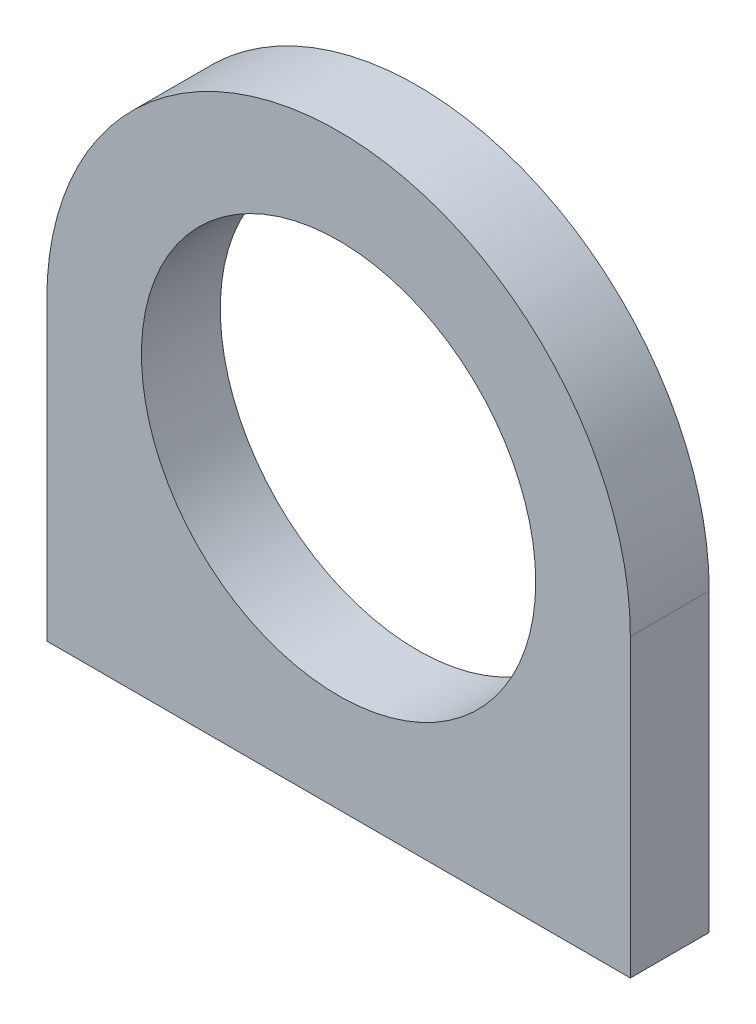
ISO-10303-21;
HEADER;
FILE_DESCRIPTION(('STEP AP214'),'2;1');
FILE_NAME('part.step','',(''),(''),'','','');
FILE_SCHEMA(('AUTOMOTIVE_DESIGN { 1 0 10303 214 1 1 1 1 }'));
ENDSEC;
DATA;
#1=APPLICATION_CONTEXT('core data for automotive mechanical design processes');
#2=APPLICATION_PROTOCOL_DEFINITION('international standard','automotive_design',2000,#1);
#3=PRODUCT_CONTEXT('',#1,'mechanical');
#4=PRODUCT('Part','Part','',(#3));
#5=PRODUCT_RELATED_PRODUCT_CATEGORY('part','',(#4));
#6=PRODUCT_DEFINITION_FORMATION('','',#4);
#7=PRODUCT_DEFINITION_CONTEXT('part definition',#1,'design');
#8=PRODUCT_DEFINITION('design','',#6,#7);
#9=PRODUCT_DEFINITION_SHAPE('','',#8);
#10=(LENGTH_UNIT() NAMED_UNIT(*) SI_UNIT(.MILLI.,.METRE.));
#11=(NAMED_UNIT(*) PLANE_ANGLE_UNIT() SI_UNIT($,.RADIAN.));
#12=(NAMED_UNIT(*) SI_UNIT($,.STERADIAN.) SOLID_ANGLE_UNIT());
#13=UNCERTAINTY_MEASURE_WITH_UNIT(LENGTH_MEASURE(1.E-05),#10,'distance_accuracy_value','');
#14=(GEOMETRIC_REPRESENTATION_CONTEXT(3) GLOBAL_UNCERTAINTY_ASSIGNED_CONTEXT((#13)) GLOBAL_UNIT_ASSIGNED_CONTEXT((#10,
#11,#12)) REPRESENTATION_CONTEXT('',''));
#15=CARTESIAN_POINT('',(0.,0.,0.));
#16=DIRECTION('',(0.,0.,1.));
#17=DIRECTION('',(1.,0.,0.));
#18=AXIS2_PLACEMENT_3D('',#15,#16,#17);
#19=CARTESIAN_POINT('',(18.5,0.,-2.5));
#20=DIRECTION('',(-1.,0.,0.));
#21=DIRECTION('',(0.,0.,1.));
#22=AXIS2_PLACEMENT_3D('',#19,#20,#21);
#23=PLANE('',#22);
#24=DIRECTION('',(0.,0.,1.));
#25=VECTOR('',#24,1.);
#26=CARTESIAN_POINT('',(18.5,0.,-2.5));
#27=LINE('',#26,#25);
#28=CARTESIAN_POINT('',(18.5,0.,-2.5));
#29=VERTEX_POINT('',#28);
#30=CARTESIAN_POINT('',(18.5,0.,2.5));
#31=VERTEX_POINT('',#30);
#32=EDGE_CURVE('E37',#29,#31,#27,.T.);
#33=ORIENTED_EDGE('',*,*,#32,.T.);
#34=DIRECTION('',(0.,-1.,0.));
#35=VECTOR('',#34,1.);
#36=CARTESIAN_POINT('',(18.5,0.,2.5));
#37=LINE('',#36,#35);
#38=CARTESIAN_POINT('',(18.5,-18.75,2.5));
#39=VERTEX_POINT('',#38);
#40=EDGE_CURVE('E76',#31,#39,#37,.T.);
#41=ORIENTED_EDGE('',*,*,#40,.T.);
#42=DIRECTION('',(0.,0.,1.));
#43=VECTOR('',#42,1.);
#44=CARTESIAN_POINT('',(18.5,-18.75,-2.5));
#45=LINE('',#44,#43);
#46=CARTESIAN_POINT('',(18.5,-18.75,-2.5));
#47=VERTEX_POINT('',#46);
#48=EDGE_CURVE('E11',#47,#39,#45,.T.);
#49=ORIENTED_EDGE('',*,*,#48,.F.);
#50=DIRECTION('',(0.,-1.,0.));
#51=VECTOR('',#50,1.);
#52=CARTESIAN_POINT('',(18.5,0.,-2.5));
#53=LINE('',#52,#51);
#54=EDGE_CURVE('E78',#29,#47,#53,.T.);
#55=ORIENTED_EDGE('',*,*,#54,.F.);
#56=EDGE_LOOP('',(#33,#41,#49,#55));
#57=FACE_BOUND('',#56,.T.);
#58=ADVANCED_FACE('F34',(#57),#23,.F.);
#59=CARTESIAN_POINT('',(0.,-18.75,-2.5));
#60=DIRECTION('',(0.,1.,0.));
#61=DIRECTION('',(0.,0.,1.));
#62=AXIS2_PLACEMENT_3D('',#59,#60,#61);
#63=PLANE('',#62);
#64=CARTESIAN_POINT('',(16.,-18.75,0.));
#65=DIRECTION('',(0.,1.,0.));
#66=DIRECTION('',(0.,0.,-1.));
#67=AXIS2_PLACEMENT_3D('',#64,#65,#66);
#68=CIRCLE('',#67,1.5);
#69=CARTESIAN_POINT('',(16.,-18.75,-1.5));
#70=VERTEX_POINT('',#69);
#71=EDGE_CURVE('E170',#70,#70,#68,.T.);
#72=ORIENTED_EDGE('',*,*,#71,.T.);
#73=EDGE_LOOP('',(#72));
#74=FACE_BOUND('',#73,.T.);
#75=CARTESIAN_POINT('',(-16.,-18.75,0.));
#76=DIRECTION('',(0.,-1.,0.));
#77=DIRECTION('',(0.,0.,-1.));
#78=AXIS2_PLACEMENT_3D('',#75,#76,#77);
#79=CIRCLE('',#78,1.5);
#80=CARTESIAN_POINT('',(-16.,-18.75,-1.5));
#81=VERTEX_POINT('',#80);
#82=EDGE_CURVE('E99',#81,#81,#79,.T.);
#83=ORIENTED_EDGE('',*,*,#82,.F.);
#84=EDGE_LOOP('',(#83));
#85=FACE_BOUND('',#84,.T.);
#86=ORIENTED_EDGE('',*,*,#48,.T.);
#87=DIRECTION('',(-1.,0.,0.));
#88=VECTOR('',#87,1.);
#89=CARTESIAN_POINT('',(0.,-18.75,2.5));
#90=LINE('',#89,#88);
#91=CARTESIAN_POINT('',(-18.5,-18.75,2.5));
#92=VERTEX_POINT('',#91);
#93=EDGE_CURVE('E95',#39,#92,#90,.T.);
#94=ORIENTED_EDGE('',*,*,#93,.T.);
#95=DIRECTION('',(0.,0.,1.));
#96=VECTOR('',#95,1.);
#97=CARTESIAN_POINT('',(-18.5,-18.75,-2.5));
#98=LINE('',#97,#96);
#99=CARTESIAN_POINT('',(-18.5,-18.75,-2.5));
#100=VERTEX_POINT('',#99);
#101=EDGE_CURVE('E42',#100,#92,#98,.T.);
#102=ORIENTED_EDGE('',*,*,#101,.F.);
#103=DIRECTION('',(-1.,0.,0.));
#104=VECTOR('',#103,1.);
#105=CARTESIAN_POINT('',(0.,-18.75,-2.5));
#106=LINE('',#105,#104);
#107=EDGE_CURVE('E49',#47,#100,#106,.T.);
#108=ORIENTED_EDGE('',*,*,#107,.F.);
#109=EDGE_LOOP('',(#86,#94,#102,#108));
#110=FACE_BOUND('',#109,.T.);
#111=ADVANCED_FACE('F119',(#74,#85,#110),#63,.F.);
#112=CARTESIAN_POINT('',(-18.5,0.,-2.5));
#113=DIRECTION('',(-1.,0.,0.));
#114=DIRECTION('',(0.,0.,1.));
#115=AXIS2_PLACEMENT_3D('',#112,#113,#114);
#116=PLANE('',#115);
#117=ORIENTED_EDGE('',*,*,#101,.T.);
#118=DIRECTION('',(0.,-1.,0.));
#119=VECTOR('',#118,1.);
#120=CARTESIAN_POINT('',(-18.5,0.,2.5));
#121=LINE('',#120,#119);
#122=CARTESIAN_POINT('',(-18.5,0.,2.5));
#123=VERTEX_POINT('',#122);
#124=EDGE_CURVE('E90',#123,#92,#121,.T.);
#125=ORIENTED_EDGE('',*,*,#124,.F.);
#126=DIRECTION('',(0.,0.,1.));
#127=VECTOR('',#126,1.);
#128=CARTESIAN_POINT('',(-18.5,0.,-2.5));
#129=LINE('',#128,#127);
#130=CARTESIAN_POINT('',(-18.5,0.,-2.5));
#131=VERTEX_POINT('',#130);
#132=EDGE_CURVE('E82',#131,#123,#129,.T.);
#133=ORIENTED_EDGE('',*,*,#132,.F.);
#134=DIRECTION('',(0.,-1.,0.));
#135=VECTOR('',#134,1.);
#136=CARTESIAN_POINT('',(-18.5,0.,-2.5));
#137=LINE('',#136,#135);
#138=EDGE_CURVE('E111',#131,#100,#137,.T.);
#139=ORIENTED_EDGE('',*,*,#138,.T.);
#140=EDGE_LOOP('',(#117,#125,#133,#139));
#141=FACE_BOUND('',#140,.T.);
#142=ADVANCED_FACE('F118',(#141),#116,.T.);
#143=CARTESIAN_POINT('',(0.,0.,-2.5));
#144=DIRECTION('',(0.,0.,1.));
#145=DIRECTION('',(1.,0.,0.));
#146=AXIS2_PLACEMENT_3D('',#143,#144,#145);
#147=CYLINDRICAL_SURFACE('',#146,18.5);
#148=ORIENTED_EDGE('',*,*,#132,.T.);
#149=CARTESIAN_POINT('',(0.,0.,2.5));
#150=DIRECTION('',(0.,0.,1.));
#151=DIRECTION('',(1.,0.,0.));
#152=AXIS2_PLACEMENT_3D('',#149,#150,#151);
#153=CIRCLE('',#152,18.5);
#154=EDGE_CURVE('E85',#31,#123,#153,.T.);
#155=ORIENTED_EDGE('',*,*,#154,.F.);
#156=ORIENTED_EDGE('',*,*,#32,.F.);
#157=CARTESIAN_POINT('',(0.,0.,-2.5));
#158=DIRECTION('',(0.,0.,1.));
#159=DIRECTION('',(1.,0.,0.));
#160=AXIS2_PLACEMENT_3D('',#157,#158,#159);
#161=CIRCLE('',#160,18.5);
#162=EDGE_CURVE('E109',#29,#131,#161,.T.);
#163=ORIENTED_EDGE('',*,*,#162,.T.);
#164=EDGE_LOOP('',(#148,#155,#156,#163));
#165=FACE_BOUND('',#164,.T.);
#166=ADVANCED_FACE('F86',(#165),#147,.T.);
#167=CARTESIAN_POINT('',(0.,0.,-2.5));
#168=DIRECTION('',(0.,0.,1.));
#169=DIRECTION('',(1.,0.,0.));
#170=AXIS2_PLACEMENT_3D('',#167,#168,#169);
#171=CYLINDRICAL_SURFACE('',#170,12.5);
#172=CARTESIAN_POINT('',(0.,0.,-2.5));
#173=DIRECTION('',(0.,0.,1.));
#174=DIRECTION('',(1.,0.,0.));
#175=AXIS2_PLACEMENT_3D('',#172,#173,#174);
#176=CIRCLE('',#175,12.5);
#177=CARTESIAN_POINT('',(12.5,0.,-2.5));
#178=VERTEX_POINT('',#177);
#179=EDGE_CURVE('E83',#178,#178,#176,.T.);
#180=ORIENTED_EDGE('',*,*,#179,.F.);
#181=EDGE_LOOP('',(#180));
#182=FACE_BOUND('',#181,.T.);
#183=CARTESIAN_POINT('',(0.,0.,2.5));
#184=DIRECTION('',(0.,0.,1.));
#185=DIRECTION('',(1.,0.,0.));
#186=AXIS2_PLACEMENT_3D('',#183,#184,#185);
#187=CIRCLE('',#186,12.5);
#188=CARTESIAN_POINT('',(12.5,0.,2.5));
#189=VERTEX_POINT('',#188);
#190=EDGE_CURVE('E105',#189,#189,#187,.T.);
#191=ORIENTED_EDGE('',*,*,#190,.T.);
#192=EDGE_LOOP('',(#191));
#193=FACE_BOUND('',#192,.T.);
#194=ADVANCED_FACE('F131',(#182,#193),#171,.F.);
#195=CARTESIAN_POINT('',(0.,0.,-2.5));
#196=DIRECTION('',(0.,0.,1.));
#197=DIRECTION('',(1.,0.,0.));
#198=AXIS2_PLACEMENT_3D('',#195,#196,#197);
#199=PLANE('',#198);
#200=ORIENTED_EDGE('',*,*,#54,.T.);
#201=ORIENTED_EDGE('',*,*,#107,.T.);
#202=ORIENTED_EDGE('',*,*,#138,.F.);
#203=ORIENTED_EDGE('',*,*,#162,.F.);
#204=EDGE_LOOP('',(#200,#201,#202,#203));
#205=FACE_BOUND('',#204,.T.);
#206=ORIENTED_EDGE('',*,*,#179,.T.);
#207=EDGE_LOOP('',(#206));
#208=FACE_BOUND('',#207,.T.);
#209=ADVANCED_FACE('F137',(#205,#208),#199,.F.);
#210=CARTESIAN_POINT('',(0.,0.,2.5));
#211=DIRECTION('',(0.,0.,1.));
#212=DIRECTION('',(1.,0.,0.));
#213=AXIS2_PLACEMENT_3D('',#210,#211,#212);
#214=PLANE('',#213);
#215=ORIENTED_EDGE('',*,*,#40,.F.);
#216=ORIENTED_EDGE('',*,*,#154,.T.);
#217=ORIENTED_EDGE('',*,*,#124,.T.);
#218=ORIENTED_EDGE('',*,*,#93,.F.);
#219=EDGE_LOOP('',(#215,#216,#217,#218));
#220=FACE_BOUND('',#219,.T.);
#221=ORIENTED_EDGE('',*,*,#190,.F.);
#222=EDGE_LOOP('',(#221));
#223=FACE_BOUND('',#222,.T.);
#224=ADVANCED_FACE('F92',(#220,#223),#214,.T.);
#225=CARTESIAN_POINT('',(-16.,-8.75,0.));
#226=DIRECTION('',(0.,-1.,0.));
#227=DIRECTION('',(0.,0.,-1.));
#228=AXIS2_PLACEMENT_3D('',#225,#226,#227);
#229=CYLINDRICAL_SURFACE('',#228,1.5);
#230=CARTESIAN_POINT('',(-16.,-8.75,0.));
#231=DIRECTION('',(0.,-1.,0.));
#232=DIRECTION('',(0.,0.,-1.));
#233=AXIS2_PLACEMENT_3D('',#230,#231,#232);
#234=CIRCLE('',#233,1.5);
#235=CARTESIAN_POINT('',(-16.,-8.75,-1.5));
#236=VERTEX_POINT('',#235);
#237=EDGE_CURVE('E96',#236,#236,#234,.T.);
#238=ORIENTED_EDGE('',*,*,#237,.F.);
#239=EDGE_LOOP('',(#238));
#240=FACE_BOUND('',#239,.T.);
#241=ORIENTED_EDGE('',*,*,#82,.T.);
#242=EDGE_LOOP('',(#241));
#243=FACE_BOUND('',#242,.T.);
#244=ADVANCED_FACE('F146',(#240,#243),#229,.F.);
#245=CARTESIAN_POINT('',(-16.,-8.75,0.));
#246=DIRECTION('',(0.,-1.,0.));
#247=DIRECTION('',(0.,0.,-1.));
#248=AXIS2_PLACEMENT_3D('',#245,#246,#247);
#249=PLANE('',#248);
#250=ORIENTED_EDGE('',*,*,#237,.T.);
#251=EDGE_LOOP('',(#250));
#252=FACE_BOUND('',#251,.T.);
#253=ADVANCED_FACE('F151',(#252),#249,.T.);
#254=CARTESIAN_POINT('',(16.,-8.75,0.));
#255=DIRECTION('',(0.,-1.,0.));
#256=DIRECTION('',(0.,0.,-1.));
#257=AXIS2_PLACEMENT_3D('',#254,#255,#256);
#258=CYLINDRICAL_SURFACE('',#257,1.5);
#259=CARTESIAN_POINT('',(16.,-8.75,0.));
#260=DIRECTION('',(0.,1.,0.));
#261=DIRECTION('',(0.,0.,-1.));
#262=AXIS2_PLACEMENT_3D('',#259,#260,#261);
#263=CIRCLE('',#262,1.5);
#264=CARTESIAN_POINT('',(16.,-8.75,-1.5));
#265=VERTEX_POINT('',#264);
#266=EDGE_CURVE('E169',#265,#265,#263,.T.);
#267=ORIENTED_EDGE('',*,*,#266,.T.);
#268=EDGE_LOOP('',(#267));
#269=FACE_BOUND('',#268,.T.);
#270=ORIENTED_EDGE('',*,*,#71,.F.);
#271=EDGE_LOOP('',(#270));
#272=FACE_BOUND('',#271,.T.);
#273=ADVANCED_FACE('F157',(#269,#272),#258,.F.);
#274=CARTESIAN_POINT('',(16.,-8.75,0.));
#275=DIRECTION('',(0.,-1.,0.));
#276=DIRECTION('',(0.,0.,-1.));
#277=AXIS2_PLACEMENT_3D('',#274,#275,#276);
#278=PLANE('',#277);
#279=ORIENTED_EDGE('',*,*,#266,.F.);
#280=EDGE_LOOP('',(#279));
#281=FACE_BOUND('',#280,.T.);
#282=ADVANCED_FACE('F161',(#281),#278,.T.);
#283=CLOSED_SHELL('',(#58,#111,#142,#166,#194,#209,#224,#244,#253,#273,#282));
#284=MANIFOLD_SOLID_BREP('B2',#283);
#285=ADVANCED_BREP_SHAPE_REPRESENTATION('',(#18,#284),#14);
#286=SHAPE_DEFINITION_REPRESENTATION(#9,#285);
ENDSEC;
END-ISO-10303-21;
